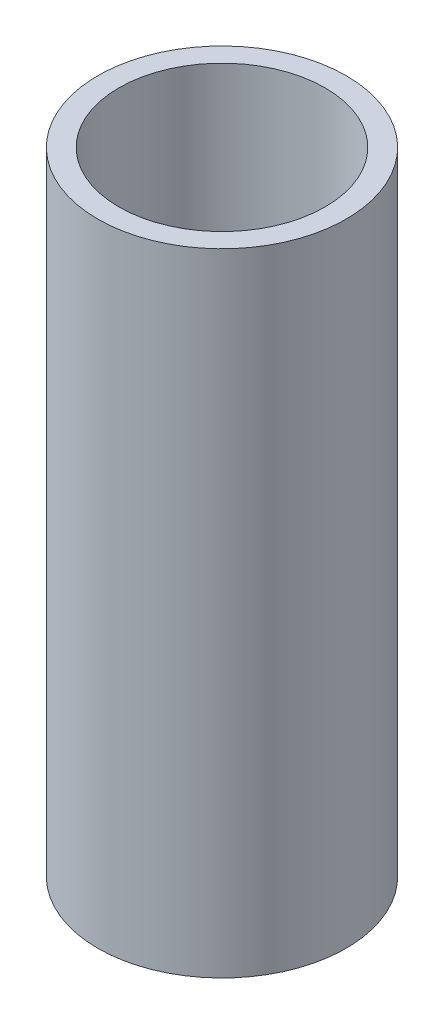
ISO-10303-21;
HEADER;
FILE_DESCRIPTION(('STEP AP214'),'2;1');
FILE_NAME('part.step','',(''),(''),'','','');
FILE_SCHEMA(('AUTOMOTIVE_DESIGN { 1 0 10303 214 1 1 1 1 }'));
ENDSEC;
DATA;
#1=APPLICATION_CONTEXT('core data for automotive mechanical design processes');
#2=APPLICATION_PROTOCOL_DEFINITION('international standard','automotive_design',2000,#1);
#3=PRODUCT_CONTEXT('',#1,'mechanical');
#4=PRODUCT('Part','Part','',(#3));
#5=PRODUCT_RELATED_PRODUCT_CATEGORY('part','',(#4));
#6=PRODUCT_DEFINITION_FORMATION('','',#4);
#7=PRODUCT_DEFINITION_CONTEXT('part definition',#1,'design');
#8=PRODUCT_DEFINITION('design','',#6,#7);
#9=PRODUCT_DEFINITION_SHAPE('','',#8);
#10=(LENGTH_UNIT() NAMED_UNIT(*) SI_UNIT(.MILLI.,.METRE.));
#11=(NAMED_UNIT(*) PLANE_ANGLE_UNIT() SI_UNIT($,.RADIAN.));
#12=(NAMED_UNIT(*) SI_UNIT($,.STERADIAN.) SOLID_ANGLE_UNIT());
#13=UNCERTAINTY_MEASURE_WITH_UNIT(LENGTH_MEASURE(1.E-05),#10,'distance_accuracy_value','');
#14=(GEOMETRIC_REPRESENTATION_CONTEXT(3) GLOBAL_UNCERTAINTY_ASSIGNED_CONTEXT((#13)) GLOBAL_UNIT_ASSIGNED_CONTEXT((#10,
#11,#12)) REPRESENTATION_CONTEXT('',''));
#15=CARTESIAN_POINT('',(0.,0.,0.));
#16=DIRECTION('',(0.,0.,1.));
#17=DIRECTION('',(1.,0.,0.));
#18=AXIS2_PLACEMENT_3D('',#15,#16,#17);
#19=CARTESIAN_POINT('',(0.,150.,0.));
#20=DIRECTION('',(0.,1.,0.));
#21=DIRECTION('',(0.,0.,1.));
#22=AXIS2_PLACEMENT_3D('',#19,#20,#21);
#23=PLANE('',#22);
#24=CARTESIAN_POINT('',(0.,150.,0.));
#25=DIRECTION('',(0.,1.,0.));
#26=DIRECTION('',(0.,0.,1.));
#27=AXIS2_PLACEMENT_3D('',#24,#25,#26);
#28=CIRCLE('',#27,29.5);
#29=CARTESIAN_POINT('',(0.,150.,29.5));
#30=VERTEX_POINT('',#29);
#31=EDGE_CURVE('E10',#30,#30,#28,.T.);
#32=ORIENTED_EDGE('',*,*,#31,.T.);
#33=EDGE_LOOP('',(#32));
#34=FACE_BOUND('',#33,.T.);
#35=CARTESIAN_POINT('',(0.,150.,0.));
#36=DIRECTION('',(0.,1.,0.));
#37=DIRECTION('',(0.,0.,1.));
#38=AXIS2_PLACEMENT_3D('',#35,#36,#37);
#39=CIRCLE('',#38,24.5);
#40=CARTESIAN_POINT('',(0.,150.,24.5));
#41=VERTEX_POINT('',#40);
#42=EDGE_CURVE('E42',#41,#41,#39,.T.);
#43=ORIENTED_EDGE('',*,*,#42,.F.);
#44=EDGE_LOOP('',(#43));
#45=FACE_BOUND('',#44,.T.);
#46=ADVANCED_FACE('F31',(#34,#45),#23,.T.);
#47=CARTESIAN_POINT('',(0.,0.,0.));
#48=DIRECTION('',(0.,1.,0.));
#49=DIRECTION('',(0.,0.,1.));
#50=AXIS2_PLACEMENT_3D('',#47,#48,#49);
#51=PLANE('',#50);
#52=CARTESIAN_POINT('',(0.,0.,0.));
#53=DIRECTION('',(0.,1.,0.));
#54=DIRECTION('',(0.,0.,1.));
#55=AXIS2_PLACEMENT_3D('',#52,#53,#54);
#56=CIRCLE('',#55,29.5);
#57=CARTESIAN_POINT('',(0.,0.,29.5));
#58=VERTEX_POINT('',#57);
#59=EDGE_CURVE('E35',#58,#58,#56,.T.);
#60=ORIENTED_EDGE('',*,*,#59,.F.);
#61=EDGE_LOOP('',(#60));
#62=FACE_BOUND('',#61,.T.);
#63=CARTESIAN_POINT('',(0.,0.,0.));
#64=DIRECTION('',(0.,1.,0.));
#65=DIRECTION('',(0.,0.,1.));
#66=AXIS2_PLACEMENT_3D('',#63,#64,#65);
#67=CIRCLE('',#66,24.5);
#68=CARTESIAN_POINT('',(0.,0.,24.5));
#69=VERTEX_POINT('',#68);
#70=EDGE_CURVE('E44',#69,#69,#67,.T.);
#71=ORIENTED_EDGE('',*,*,#70,.T.);
#72=EDGE_LOOP('',(#71));
#73=FACE_BOUND('',#72,.T.);
#74=ADVANCED_FACE('F54',(#62,#73),#51,.F.);
#75=CARTESIAN_POINT('',(0.,150.,0.));
#76=DIRECTION('',(0.,-1.,0.));
#77=DIRECTION('',(0.,0.,-1.));
#78=AXIS2_PLACEMENT_3D('',#75,#76,#77);
#79=CYLINDRICAL_SURFACE('',#78,29.5);
#80=ORIENTED_EDGE('',*,*,#31,.F.);
#81=EDGE_LOOP('',(#80));
#82=FACE_BOUND('',#81,.T.);
#83=ORIENTED_EDGE('',*,*,#59,.T.);
#84=EDGE_LOOP('',(#83));
#85=FACE_BOUND('',#84,.T.);
#86=ADVANCED_FACE('F33',(#82,#85),#79,.T.);
#87=CARTESIAN_POINT('',(0.,150.,0.));
#88=DIRECTION('',(0.,-1.,0.));
#89=DIRECTION('',(0.,0.,-1.));
#90=AXIS2_PLACEMENT_3D('',#87,#88,#89);
#91=CYLINDRICAL_SURFACE('',#90,24.5);
#92=ORIENTED_EDGE('',*,*,#42,.T.);
#93=EDGE_LOOP('',(#92));
#94=FACE_BOUND('',#93,.T.);
#95=ORIENTED_EDGE('',*,*,#70,.F.);
#96=EDGE_LOOP('',(#95));
#97=FACE_BOUND('',#96,.T.);
#98=ADVANCED_FACE('F50',(#94,#97),#91,.F.);
#99=CLOSED_SHELL('',(#46,#74,#86,#98));
#100=MANIFOLD_SOLID_BREP('B2',#99);
#101=ADVANCED_BREP_SHAPE_REPRESENTATION('',(#18,#100),#14);
#102=SHAPE_DEFINITION_REPRESENTATION(#9,#101);
ENDSEC;
END-ISO-10303-21;
